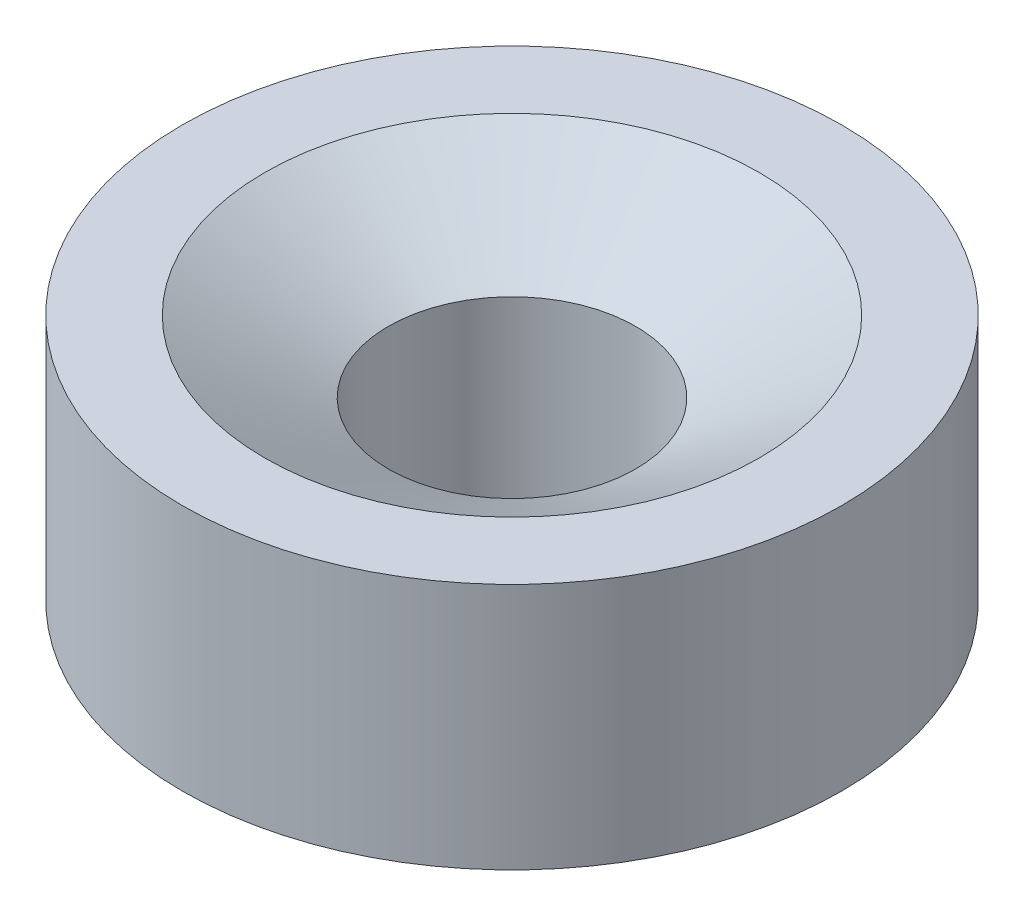
ISO-10303-21;
HEADER;
FILE_DESCRIPTION(('STEP AP214'),'2;1');
FILE_NAME('part.step','',(''),(''),'','','');
FILE_SCHEMA(('AUTOMOTIVE_DESIGN { 1 0 10303 214 1 1 1 1 }'));
ENDSEC;
DATA;
#1=APPLICATION_CONTEXT('core data for automotive mechanical design processes');
#2=APPLICATION_PROTOCOL_DEFINITION('international standard','automotive_design',2000,#1);
#3=PRODUCT_CONTEXT('',#1,'mechanical');
#4=PRODUCT('Part','Part','',(#3));
#5=PRODUCT_RELATED_PRODUCT_CATEGORY('part','',(#4));
#6=PRODUCT_DEFINITION_FORMATION('','',#4);
#7=PRODUCT_DEFINITION_CONTEXT('part definition',#1,'design');
#8=PRODUCT_DEFINITION('design','',#6,#7);
#9=PRODUCT_DEFINITION_SHAPE('','',#8);
#10=(LENGTH_UNIT() NAMED_UNIT(*) SI_UNIT(.MILLI.,.METRE.));
#11=(NAMED_UNIT(*) PLANE_ANGLE_UNIT() SI_UNIT($,.RADIAN.));
#12=(NAMED_UNIT(*) SI_UNIT($,.STERADIAN.) SOLID_ANGLE_UNIT());
#13=UNCERTAINTY_MEASURE_WITH_UNIT(LENGTH_MEASURE(1.E-05),#10,'distance_accuracy_value','');
#14=(GEOMETRIC_REPRESENTATION_CONTEXT(3) GLOBAL_UNCERTAINTY_ASSIGNED_CONTEXT((#13)) GLOBAL_UNIT_ASSIGNED_CONTEXT((#10,
#11,#12)) REPRESENTATION_CONTEXT('',''));
#15=CARTESIAN_POINT('',(0.,0.,0.));
#16=DIRECTION('',(0.,0.,1.));
#17=DIRECTION('',(1.,0.,0.));
#18=AXIS2_PLACEMENT_3D('',#15,#16,#17);
#19=CARTESIAN_POINT('',(0.,3.,0.));
#20=DIRECTION('',(0.,1.,0.));
#21=DIRECTION('',(0.,0.,1.));
#22=AXIS2_PLACEMENT_3D('',#19,#20,#21);
#23=PLANE('',#22);
#24=CARTESIAN_POINT('',(0.,3.,0.));
#25=DIRECTION('',(0.,1.,0.));
#26=DIRECTION('',(0.,0.,1.));
#27=AXIS2_PLACEMENT_3D('',#24,#25,#26);
#28=CIRCLE('',#27,3.00000000000001);
#29=CARTESIAN_POINT('',(0.,3.,3.00000000000001));
#30=VERTEX_POINT('',#29);
#31=EDGE_CURVE('E10',#30,#30,#28,.F.);
#32=ORIENTED_EDGE('',*,*,#31,.T.);
#33=EDGE_LOOP('',(#32));
#34=FACE_BOUND('',#33,.T.);
#35=CARTESIAN_POINT('',(0.,3.,0.));
#36=DIRECTION('',(0.,1.,0.));
#37=DIRECTION('',(0.,0.,1.));
#38=AXIS2_PLACEMENT_3D('',#35,#36,#37);
#39=CIRCLE('',#38,4.);
#40=CARTESIAN_POINT('',(0.,3.,4.));
#41=VERTEX_POINT('',#40);
#42=EDGE_CURVE('E53',#41,#41,#39,.T.);
#43=ORIENTED_EDGE('',*,*,#42,.T.);
#44=EDGE_LOOP('',(#43));
#45=FACE_BOUND('',#44,.T.);
#46=ADVANCED_FACE('F39',(#34,#45),#23,.T.);
#47=CARTESIAN_POINT('',(0.,0.,0.));
#48=DIRECTION('',(0.,1.,0.));
#49=DIRECTION('',(0.,0.,1.));
#50=AXIS2_PLACEMENT_3D('',#47,#48,#49);
#51=PLANE('',#50);
#52=CARTESIAN_POINT('',(0.,0.,0.));
#53=DIRECTION('',(0.,1.,0.));
#54=DIRECTION('',(0.,0.,1.));
#55=AXIS2_PLACEMENT_3D('',#52,#53,#54);
#56=CIRCLE('',#55,4.);
#57=CARTESIAN_POINT('',(0.,0.,4.));
#58=VERTEX_POINT('',#57);
#59=EDGE_CURVE('E58',#58,#58,#56,.T.);
#60=ORIENTED_EDGE('',*,*,#59,.F.);
#61=EDGE_LOOP('',(#60));
#62=FACE_BOUND('',#61,.T.);
#63=CARTESIAN_POINT('',(0.,0.,0.));
#64=DIRECTION('',(0.,1.,0.));
#65=DIRECTION('',(0.,0.,1.));
#66=AXIS2_PLACEMENT_3D('',#63,#64,#65);
#67=CIRCLE('',#66,1.5);
#68=CARTESIAN_POINT('',(0.,0.,1.5));
#69=VERTEX_POINT('',#68);
#70=EDGE_CURVE('E63',#69,#69,#67,.T.);
#71=ORIENTED_EDGE('',*,*,#70,.T.);
#72=EDGE_LOOP('',(#71));
#73=FACE_BOUND('',#72,.T.);
#74=ADVANCED_FACE('F69',(#62,#73),#51,.F.);
#75=CARTESIAN_POINT('',(0.,3.,0.));
#76=DIRECTION('',(0.,-1.,0.));
#77=DIRECTION('',(0.,0.,-1.));
#78=AXIS2_PLACEMENT_3D('',#75,#76,#77);
#79=CYLINDRICAL_SURFACE('',#78,4.);
#80=ORIENTED_EDGE('',*,*,#42,.F.);
#81=EDGE_LOOP('',(#80));
#82=FACE_BOUND('',#81,.T.);
#83=ORIENTED_EDGE('',*,*,#59,.T.);
#84=EDGE_LOOP('',(#83));
#85=FACE_BOUND('',#84,.T.);
#86=ADVANCED_FACE('F73',(#82,#85),#79,.T.);
#87=CARTESIAN_POINT('',(0.,3.,0.));
#88=DIRECTION('',(0.,-1.,0.));
#89=DIRECTION('',(0.,0.,-1.));
#90=AXIS2_PLACEMENT_3D('',#87,#88,#89);
#91=CYLINDRICAL_SURFACE('',#90,1.5);
#92=CARTESIAN_POINT('',(0.,2.13397459621556,0.));
#93=DIRECTION('',(0.,1.,0.));
#94=DIRECTION('',(0.,0.,1.));
#95=AXIS2_PLACEMENT_3D('',#92,#93,#94);
#96=CIRCLE('',#95,1.5);
#97=CARTESIAN_POINT('',(0.,2.13397459621556,1.5));
#98=VERTEX_POINT('',#97);
#99=EDGE_CURVE('E48',#98,#98,#96,.T.);
#100=ORIENTED_EDGE('',*,*,#99,.T.);
#101=EDGE_LOOP('',(#100));
#102=FACE_BOUND('',#101,.T.);
#103=ORIENTED_EDGE('',*,*,#70,.F.);
#104=EDGE_LOOP('',(#103));
#105=FACE_BOUND('',#104,.T.);
#106=ADVANCED_FACE('F71',(#102,#105),#91,.F.);
#107=CARTESIAN_POINT('',(0.,2.13397459621556,0.));
#108=DIRECTION('',(0.,1.,0.));
#109=DIRECTION('',(0.,0.,1.));
#110=AXIS2_PLACEMENT_3D('',#107,#108,#109);
#111=CONICAL_SURFACE('',#110,1.5,1.0471975511966);
#112=CARTESIAN_POINT('',(0.,3.,3.00000000000001));
#113=CARTESIAN_POINT('',(0.,2.99097890204391,2.98437500000001));
#114=CARTESIAN_POINT('',(0.,2.98195780408782,2.96875000000001));
#115=CARTESIAN_POINT('',(0.,2.96391560817565,2.93750000000001));
#116=CARTESIAN_POINT('',(0.,2.95489451021956,2.92187500000001));
#117=CARTESIAN_POINT('',(0.,2.93685231430738,2.89062500000001));
#118=CARTESIAN_POINT('',(0.,2.9278312163513,2.87500000000001));
#119=CARTESIAN_POINT('',(0.,2.90978902043912,2.84375000000001));
#120=CARTESIAN_POINT('',(0.,2.90076792248303,2.82812500000001));
#121=CARTESIAN_POINT('',(0.,2.88272572657086,2.79687500000001));
#122=CARTESIAN_POINT('',(0.,2.87370462861477,2.78125000000001));
#123=CARTESIAN_POINT('',(0.,2.85566243270259,2.75000000000001));
#124=CARTESIAN_POINT('',(0.,2.8466413347465,2.73437500000001));
#125=CARTESIAN_POINT('',(0.,2.82859913883433,2.70312500000001));
#126=CARTESIAN_POINT('',(0.,2.81957804087824,2.68750000000001));
#127=CARTESIAN_POINT('',(0.,2.80153584496607,2.65625000000001));
#128=CARTESIAN_POINT('',(0.,2.79251474700998,2.64062500000001));
#129=CARTESIAN_POINT('',(0.,2.7744725510978,2.60937500000001));
#130=CARTESIAN_POINT('',(0.,2.76545145314171,2.59375000000001));
#131=CARTESIAN_POINT('',(0.,2.74740925722954,2.56250000000001));
#132=CARTESIAN_POINT('',(0.,2.73838815927345,2.54687500000001));
#133=CARTESIAN_POINT('',(0.,2.72034596336127,2.51562500000001));
#134=CARTESIAN_POINT('',(0.,2.71132486540519,2.50000000000001));
#135=CARTESIAN_POINT('',(0.,2.69328266949301,2.46875000000001));
#136=CARTESIAN_POINT('',(0.,2.68426157153692,2.45312500000001));
#137=CARTESIAN_POINT('',(0.,2.66621937562475,2.42187500000001));
#138=CARTESIAN_POINT('',(0.,2.65719827766866,2.40625000000001));
#139=CARTESIAN_POINT('',(0.,2.63915608175648,2.37500000000001));
#140=CARTESIAN_POINT('',(0.,2.63013498380039,2.35937500000001));
#141=CARTESIAN_POINT('',(0.,2.61209278788822,2.32812500000001));
#142=CARTESIAN_POINT('',(0.,2.60307168993213,2.31250000000001));
#143=CARTESIAN_POINT('',(0.,2.58502949401996,2.28125000000001));
#144=CARTESIAN_POINT('',(0.,2.57600839606387,2.26562500000001));
#145=CARTESIAN_POINT('',(0.,2.55796620015169,2.23437500000001));
#146=CARTESIAN_POINT('',(0.,2.5489451021956,2.21875));
#147=CARTESIAN_POINT('',(0.,2.53090290628343,2.1875));
#148=CARTESIAN_POINT('',(0.,2.52188180832734,2.171875));
#149=CARTESIAN_POINT('',(0.,2.50383961241516,2.140625));
#150=CARTESIAN_POINT('',(0.,2.49481851445908,2.125));
#151=CARTESIAN_POINT('',(0.,2.4767763185469,2.09375));
#152=CARTESIAN_POINT('',(0.,2.46775522059081,2.078125));
#153=CARTESIAN_POINT('',(0.,2.44971302467864,2.046875));
#154=CARTESIAN_POINT('',(0.,2.44069192672255,2.03125));
#155=CARTESIAN_POINT('',(0.,2.42264973081037,2.));
#156=CARTESIAN_POINT('',(0.,2.41362863285428,1.984375));
#157=CARTESIAN_POINT('',(0.,2.39558643694211,1.953125));
#158=CARTESIAN_POINT('',(0.,2.38656533898602,1.9375));
#159=CARTESIAN_POINT('',(0.,2.36852314307385,1.90625));
#160=CARTESIAN_POINT('',(0.,2.35950204511776,1.890625));
#161=CARTESIAN_POINT('',(0.,2.34145984920558,1.859375));
#162=CARTESIAN_POINT('',(0.,2.33243875124949,1.84375));
#163=CARTESIAN_POINT('',(0.,2.31439655533732,1.8125));
#164=CARTESIAN_POINT('',(0.,2.30537545738123,1.796875));
#165=CARTESIAN_POINT('',(0.,2.28733326146905,1.765625));
#166=CARTESIAN_POINT('',(0.,2.27831216351297,1.75));
#167=CARTESIAN_POINT('',(0.,2.26026996760079,1.71875));
#168=CARTESIAN_POINT('',(0.,2.2512488696447,1.703125));
#169=CARTESIAN_POINT('',(0.,2.23320667373253,1.671875));
#170=CARTESIAN_POINT('',(0.,2.22418557577644,1.65625));
#171=CARTESIAN_POINT('',(0.,2.20614337986426,1.625));
#172=CARTESIAN_POINT('',(0.,2.19712228190817,1.609375));
#173=CARTESIAN_POINT('',(0.,2.179080085996,1.578125));
#174=CARTESIAN_POINT('',(0.,2.17005898803991,1.5625));
#175=CARTESIAN_POINT('',(0.,2.15201679212774,1.53125));
#176=CARTESIAN_POINT('',(0.,2.14299569417165,1.515625));
#177=CARTESIAN_POINT('',(0.,2.13397459621556,1.5));
#178=B_SPLINE_CURVE_WITH_KNOTS('',3,(#112,#113,#114,#115,#116,#117,#118,#119,#120,#121,#122,
#123,#124,#125,#126,#127,#128,#129,#130,#131,#132,#133,#134,#135,#136,#137,#138,#139,#140,#141,
#142,#143,#144,#145,#146,#147,#148,#149,#150,#151,#152,#153,#154,#155,#156,#157,#158,#159,#160,
#161,#162,#163,#164,#165,#166,#167,#168,#169,#170,#171,#172,#173,#174,#175,#176,#177),
.UNSPECIFIED.,.F.,.F.,(4,2,2,2,2,2,2,2,2,2,2,2,2,2,2,2,2,2,2,2,2,2,2,2,2,2,2,2,2,2,2,2,4),(0.,
0.0541265877365277,0.108253175473055,0.162379763209583,0.216506350946111,0.270632938682638,
0.324759526419167,0.378886114155694,0.433012701892222,0.487139289628749,0.541265877365277,
0.595392465101805,0.649519052838333,0.70364564057486,0.757772228311388,0.811898816047916,
0.866025403784444,0.920151991520971,0.974278579257499,1.02840516699403,1.08253175473055,
1.13665834246708,1.19078493020361,1.24491151794014,1.29903810567667,1.35316469341319,
1.40729128114972,1.46141786888625,1.51554445662278,1.5696710443593,1.62379763209583,
1.67792421983236,1.73205080756889),.UNSPECIFIED.);
#179=EDGE_CURVE('BSEAM42',#30,#98,#178,.T.);
#180=ORIENTED_EDGE('',*,*,#31,.F.);
#181=ORIENTED_EDGE('',*,*,#99,.F.);
#182=ORIENTED_EDGE('',*,*,#179,.T.);
#183=ORIENTED_EDGE('',*,*,#179,.F.);
#184=EDGE_LOOP('',(#180,#182,#181,#183));
#185=FACE_BOUND('',#184,.T.);
#186=ADVANCED_FACE('F42',(#185),#111,.F.);
#187=CLOSED_SHELL('',(#46,#74,#86,#106,#186));
#188=MANIFOLD_SOLID_BREP('B2',#187);
#189=ADVANCED_BREP_SHAPE_REPRESENTATION('',(#18,#188),#14);
#190=SHAPE_DEFINITION_REPRESENTATION(#9,#189);
ENDSEC;
END-ISO-10303-21;
